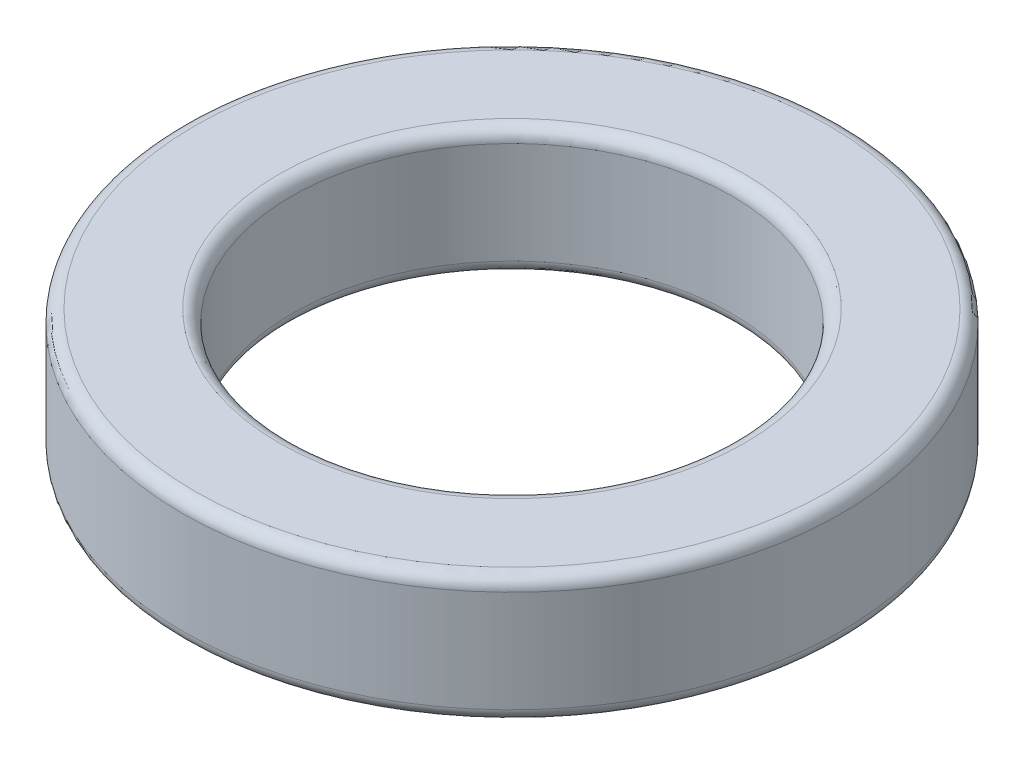
ISO-10303-21;
HEADER;
FILE_DESCRIPTION(('STEP AP214'),'2;1');
FILE_NAME('part.step','',(''),(''),'','','');
FILE_SCHEMA(('AUTOMOTIVE_DESIGN { 1 0 10303 214 1 1 1 1 }'));
ENDSEC;
DATA;
#1=APPLICATION_CONTEXT('core data for automotive mechanical design processes');
#2=APPLICATION_PROTOCOL_DEFINITION('international standard','automotive_design',2000,#1);
#3=PRODUCT_CONTEXT('',#1,'mechanical');
#4=PRODUCT('Part','Part','',(#3));
#5=PRODUCT_RELATED_PRODUCT_CATEGORY('part','',(#4));
#6=PRODUCT_DEFINITION_FORMATION('','',#4);
#7=PRODUCT_DEFINITION_CONTEXT('part definition',#1,'design');
#8=PRODUCT_DEFINITION('design','',#6,#7);
#9=PRODUCT_DEFINITION_SHAPE('','',#8);
#10=(LENGTH_UNIT() NAMED_UNIT(*) SI_UNIT(.MILLI.,.METRE.));
#11=(NAMED_UNIT(*) PLANE_ANGLE_UNIT() SI_UNIT($,.RADIAN.));
#12=(NAMED_UNIT(*) SI_UNIT($,.STERADIAN.) SOLID_ANGLE_UNIT());
#13=UNCERTAINTY_MEASURE_WITH_UNIT(LENGTH_MEASURE(1.E-05),#10,'distance_accuracy_value','');
#14=(GEOMETRIC_REPRESENTATION_CONTEXT(3) GLOBAL_UNCERTAINTY_ASSIGNED_CONTEXT((#13)) GLOBAL_UNIT_ASSIGNED_CONTEXT((#10,
#11,#12)) REPRESENTATION_CONTEXT('',''));
#15=CARTESIAN_POINT('',(0.,0.,0.));
#16=DIRECTION('',(0.,0.,1.));
#17=DIRECTION('',(1.,0.,0.));
#18=AXIS2_PLACEMENT_3D('',#15,#16,#17);
#19=CARTESIAN_POINT('',(0.,5.,0.));
#20=DIRECTION('',(0.,1.,0.));
#21=DIRECTION('',(0.,0.,1.));
#22=AXIS2_PLACEMENT_3D('',#19,#20,#21);
#23=PLANE('',#22);
#24=CARTESIAN_POINT('',(0.,5.,0.));
#25=DIRECTION('',(0.,1.,0.));
#26=DIRECTION('',(0.,0.,1.));
#27=AXIS2_PLACEMENT_3D('',#24,#25,#26);
#28=CIRCLE('',#27,9.15);
#29=CARTESIAN_POINT('',(0.,5.,9.15));
#30=VERTEX_POINT('',#29);
#31=EDGE_CURVE('E10',#30,#30,#28,.F.);
#32=ORIENTED_EDGE('',*,*,#31,.T.);
#33=EDGE_LOOP('',(#32));
#34=FACE_BOUND('',#33,.T.);
#35=CARTESIAN_POINT('',(0.,5.,0.));
#36=DIRECTION('',(0.,1.,0.));
#37=DIRECTION('',(0.,0.,1.));
#38=AXIS2_PLACEMENT_3D('',#35,#36,#37);
#39=CIRCLE('',#38,12.45);
#40=CARTESIAN_POINT('',(0.,5.,12.45));
#41=VERTEX_POINT('',#40);
#42=EDGE_CURVE('E38',#41,#41,#39,.T.);
#43=ORIENTED_EDGE('',*,*,#42,.T.);
#44=EDGE_LOOP('',(#43));
#45=FACE_BOUND('',#44,.T.);
#46=ADVANCED_FACE('F31',(#34,#45),#23,.T.);
#47=CARTESIAN_POINT('',(0.,0.,0.));
#48=DIRECTION('',(0.,1.,0.));
#49=DIRECTION('',(0.,0.,1.));
#50=AXIS2_PLACEMENT_3D('',#47,#48,#49);
#51=PLANE('',#50);
#52=CARTESIAN_POINT('',(0.,0.,0.));
#53=DIRECTION('',(0.,1.,0.));
#54=DIRECTION('',(0.,0.,1.));
#55=AXIS2_PLACEMENT_3D('',#52,#53,#54);
#56=CIRCLE('',#55,9.15);
#57=CARTESIAN_POINT('',(0.,0.,9.15));
#58=VERTEX_POINT('',#57);
#59=EDGE_CURVE('E57',#58,#58,#56,.T.);
#60=ORIENTED_EDGE('',*,*,#59,.T.);
#61=EDGE_LOOP('',(#60));
#62=FACE_BOUND('',#61,.T.);
#63=CARTESIAN_POINT('',(0.,0.,0.));
#64=DIRECTION('',(0.,1.,0.));
#65=DIRECTION('',(0.,0.,1.));
#66=AXIS2_PLACEMENT_3D('',#63,#64,#65);
#67=CIRCLE('',#66,12.45);
#68=CARTESIAN_POINT('',(0.,0.,12.45));
#69=VERTEX_POINT('',#68);
#70=EDGE_CURVE('E60',#69,#69,#67,.F.);
#71=ORIENTED_EDGE('',*,*,#70,.T.);
#72=EDGE_LOOP('',(#71));
#73=FACE_BOUND('',#72,.T.);
#74=ADVANCED_FACE('F64',(#62,#73),#51,.F.);
#75=CARTESIAN_POINT('',(0.,5.,0.));
#76=DIRECTION('',(0.,-1.,0.));
#77=DIRECTION('',(0.,0.,-1.));
#78=AXIS2_PLACEMENT_3D('',#75,#76,#77);
#79=CYLINDRICAL_SURFACE('',#78,12.95);
#80=CARTESIAN_POINT('',(0.,0.5,0.));
#81=DIRECTION('',(0.,1.,0.));
#82=DIRECTION('',(0.,0.,1.));
#83=AXIS2_PLACEMENT_3D('',#80,#81,#82);
#84=CIRCLE('',#83,12.95);
#85=CARTESIAN_POINT('',(0.,0.5,12.95));
#86=VERTEX_POINT('',#85);
#87=EDGE_CURVE('E42',#86,#86,#84,.T.);
#88=ORIENTED_EDGE('',*,*,#87,.T.);
#89=EDGE_LOOP('',(#88));
#90=FACE_BOUND('',#89,.T.);
#91=CARTESIAN_POINT('',(0.,4.5,0.));
#92=DIRECTION('',(0.,1.,0.));
#93=DIRECTION('',(0.,0.,1.));
#94=AXIS2_PLACEMENT_3D('',#91,#92,#93);
#95=CIRCLE('',#94,12.95);
#96=CARTESIAN_POINT('',(0.,4.5,12.95));
#97=VERTEX_POINT('',#96);
#98=EDGE_CURVE('E46',#97,#97,#95,.F.);
#99=ORIENTED_EDGE('',*,*,#98,.T.);
#100=EDGE_LOOP('',(#99));
#101=FACE_BOUND('',#100,.T.);
#102=ADVANCED_FACE('F74',(#90,#101),#79,.T.);
#103=CARTESIAN_POINT('',(0.,5.,0.));
#104=DIRECTION('',(0.,-1.,0.));
#105=DIRECTION('',(0.,0.,-1.));
#106=AXIS2_PLACEMENT_3D('',#103,#104,#105);
#107=CYLINDRICAL_SURFACE('',#106,8.65);
#108=CARTESIAN_POINT('',(0.,0.5,0.));
#109=DIRECTION('',(0.,1.,0.));
#110=DIRECTION('',(0.,0.,1.));
#111=AXIS2_PLACEMENT_3D('',#108,#109,#110);
#112=CIRCLE('',#111,8.65);
#113=CARTESIAN_POINT('',(0.,0.5,8.65));
#114=VERTEX_POINT('',#113);
#115=EDGE_CURVE('E51',#114,#114,#112,.F.);
#116=ORIENTED_EDGE('',*,*,#115,.T.);
#117=EDGE_LOOP('',(#116));
#118=FACE_BOUND('',#117,.T.);
#119=CARTESIAN_POINT('',(0.,4.5,0.));
#120=DIRECTION('',(0.,1.,0.));
#121=DIRECTION('',(0.,0.,1.));
#122=AXIS2_PLACEMENT_3D('',#119,#120,#121);
#123=CIRCLE('',#122,8.65);
#124=CARTESIAN_POINT('',(0.,4.5,8.65));
#125=VERTEX_POINT('',#124);
#126=EDGE_CURVE('E54',#125,#125,#123,.T.);
#127=ORIENTED_EDGE('',*,*,#126,.T.);
#128=EDGE_LOOP('',(#127));
#129=FACE_BOUND('',#128,.T.);
#130=ADVANCED_FACE('F77',(#118,#129),#107,.F.);
#131=CARTESIAN_POINT('',(0.,0.5,0.));
#132=DIRECTION('',(0.,1.,0.));
#133=DIRECTION('',(0.,0.,1.));
#134=AXIS2_PLACEMENT_3D('',#131,#132,#133);
#135=TOROIDAL_SURFACE('',#134,9.15,0.5);
#136=ORIENTED_EDGE('',*,*,#115,.F.);
#137=EDGE_LOOP('',(#136));
#138=FACE_BOUND('',#137,.T.);
#139=ORIENTED_EDGE('',*,*,#59,.F.);
#140=EDGE_LOOP('',(#139));
#141=FACE_BOUND('',#140,.T.);
#142=ADVANCED_FACE('F70',(#138,#141),#135,.T.);
#143=CARTESIAN_POINT('',(0.,0.5,0.));
#144=DIRECTION('',(0.,1.,0.));
#145=DIRECTION('',(0.,0.,1.));
#146=AXIS2_PLACEMENT_3D('',#143,#144,#145);
#147=TOROIDAL_SURFACE('',#146,12.45,0.5);
#148=ORIENTED_EDGE('',*,*,#70,.F.);
#149=EDGE_LOOP('',(#148));
#150=FACE_BOUND('',#149,.T.);
#151=ORIENTED_EDGE('',*,*,#87,.F.);
#152=EDGE_LOOP('',(#151));
#153=FACE_BOUND('',#152,.T.);
#154=ADVANCED_FACE('F66',(#150,#153),#147,.T.);
#155=CARTESIAN_POINT('',(0.,4.5,0.));
#156=DIRECTION('',(0.,1.,0.));
#157=DIRECTION('',(0.,0.,1.));
#158=AXIS2_PLACEMENT_3D('',#155,#156,#157);
#159=TOROIDAL_SURFACE('',#158,9.15,0.5);
#160=ORIENTED_EDGE('',*,*,#31,.F.);
#161=EDGE_LOOP('',(#160));
#162=FACE_BOUND('',#161,.T.);
#163=ORIENTED_EDGE('',*,*,#126,.F.);
#164=EDGE_LOOP('',(#163));
#165=FACE_BOUND('',#164,.T.);
#166=ADVANCED_FACE('F69',(#162,#165),#159,.T.);
#167=CARTESIAN_POINT('',(0.,4.5,0.));
#168=DIRECTION('',(0.,1.,0.));
#169=DIRECTION('',(0.,0.,1.));
#170=AXIS2_PLACEMENT_3D('',#167,#168,#169);
#171=TOROIDAL_SURFACE('',#170,12.45,0.5);
#172=ORIENTED_EDGE('',*,*,#98,.F.);
#173=EDGE_LOOP('',(#172));
#174=FACE_BOUND('',#173,.T.);
#175=ORIENTED_EDGE('',*,*,#42,.F.);
#176=EDGE_LOOP('',(#175));
#177=FACE_BOUND('',#176,.T.);
#178=ADVANCED_FACE('F33',(#174,#177),#171,.T.);
#179=CLOSED_SHELL('',(#46,#74,#102,#130,#142,#154,#166,#178));
#180=MANIFOLD_SOLID_BREP('B2',#179);
#181=ADVANCED_BREP_SHAPE_REPRESENTATION('',(#18,#180),#14);
#182=SHAPE_DEFINITION_REPRESENTATION(#9,#181);
ENDSEC;
END-ISO-10303-21;
